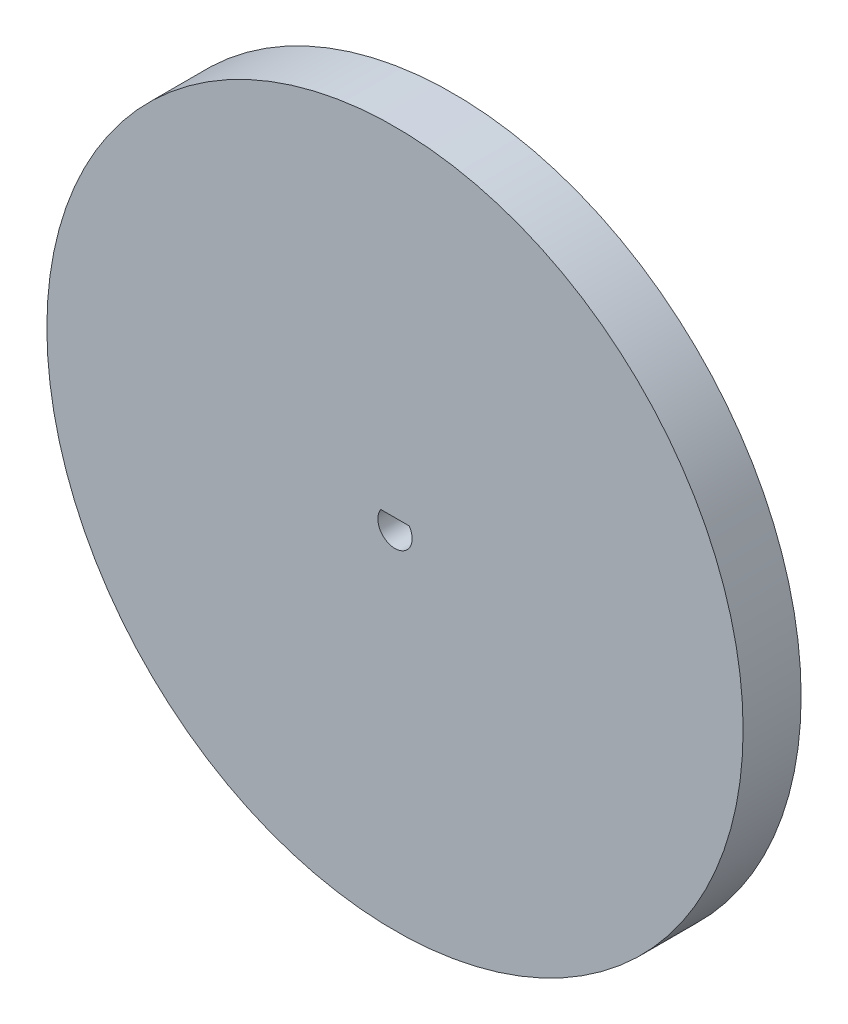
ISO-10303-21;
HEADER;
FILE_DESCRIPTION(('STEP AP214'),'2;1');
FILE_NAME('part.step','',(''),(''),'','','');
FILE_SCHEMA(('AUTOMOTIVE_DESIGN { 1 0 10303 214 1 1 1 1 }'));
ENDSEC;
DATA;
#1=APPLICATION_CONTEXT('core data for automotive mechanical design processes');
#2=APPLICATION_PROTOCOL_DEFINITION('international standard','automotive_design',2000,#1);
#3=PRODUCT_CONTEXT('',#1,'mechanical');
#4=PRODUCT('Part','Part','',(#3));
#5=PRODUCT_RELATED_PRODUCT_CATEGORY('part','',(#4));
#6=PRODUCT_DEFINITION_FORMATION('','',#4);
#7=PRODUCT_DEFINITION_CONTEXT('part definition',#1,'design');
#8=PRODUCT_DEFINITION('design','',#6,#7);
#9=PRODUCT_DEFINITION_SHAPE('','',#8);
#10=(LENGTH_UNIT() NAMED_UNIT(*) SI_UNIT(.MILLI.,.METRE.));
#11=(NAMED_UNIT(*) PLANE_ANGLE_UNIT() SI_UNIT($,.RADIAN.));
#12=(NAMED_UNIT(*) SI_UNIT($,.STERADIAN.) SOLID_ANGLE_UNIT());
#13=UNCERTAINTY_MEASURE_WITH_UNIT(LENGTH_MEASURE(1.E-05),#10,'distance_accuracy_value','');
#14=(GEOMETRIC_REPRESENTATION_CONTEXT(3) GLOBAL_UNCERTAINTY_ASSIGNED_CONTEXT((#13)) GLOBAL_UNIT_ASSIGNED_CONTEXT((#10,
#11,#12)) REPRESENTATION_CONTEXT('',''));
#15=CARTESIAN_POINT('',(0.,0.,0.));
#16=DIRECTION('',(0.,0.,1.));
#17=DIRECTION('',(1.,0.,0.));
#18=AXIS2_PLACEMENT_3D('',#15,#16,#17);
#19=CARTESIAN_POINT('',(0.,0.,6.35));
#20=DIRECTION('',(0.,0.,-1.));
#21=DIRECTION('',(-1.,0.,0.));
#22=AXIS2_PLACEMENT_3D('',#19,#20,#21);
#23=CYLINDRICAL_SURFACE('',#22,76.2);
#24=CARTESIAN_POINT('',(0.,0.,6.35));
#25=DIRECTION('',(0.,0.,1.));
#26=DIRECTION('',(1.,0.,0.));
#27=AXIS2_PLACEMENT_3D('',#24,#25,#26);
#28=CIRCLE('',#27,76.2);
#29=CARTESIAN_POINT('',(76.2,0.,6.35));
#30=VERTEX_POINT('',#29);
#31=EDGE_CURVE('E11',#30,#30,#28,.T.);
#32=ORIENTED_EDGE('',*,*,#31,.F.);
#33=EDGE_LOOP('',(#32));
#34=FACE_BOUND('',#33,.T.);
#35=CARTESIAN_POINT('',(0.,0.,-6.35));
#36=DIRECTION('',(0.,0.,1.));
#37=DIRECTION('',(1.,0.,0.));
#38=AXIS2_PLACEMENT_3D('',#35,#36,#37);
#39=CIRCLE('',#38,76.2);
#40=CARTESIAN_POINT('',(76.2,0.,-6.35));
#41=VERTEX_POINT('',#40);
#42=EDGE_CURVE('E38',#41,#41,#39,.T.);
#43=ORIENTED_EDGE('',*,*,#42,.T.);
#44=EDGE_LOOP('',(#43));
#45=FACE_BOUND('',#44,.T.);
#46=ADVANCED_FACE('F35',(#34,#45),#23,.T.);
#47=CARTESIAN_POINT('',(0.,0.,6.35));
#48=DIRECTION('',(0.,0.,1.));
#49=DIRECTION('',(1.,0.,0.));
#50=AXIS2_PLACEMENT_3D('',#47,#48,#49);
#51=PLANE('',#50);
#52=CARTESIAN_POINT('',(0.,0.,6.35));
#53=DIRECTION('',(0.,0.,1.));
#54=DIRECTION('',(1.,0.,0.));
#55=AXIS2_PLACEMENT_3D('',#52,#53,#54);
#56=CIRCLE('',#55,3.75);
#57=CARTESIAN_POINT('',(-3.1068472765812,2.1,6.35));
#58=VERTEX_POINT('',#57);
#59=CARTESIAN_POINT('',(3.1068472765812,2.1,6.35));
#60=VERTEX_POINT('',#59);
#61=EDGE_CURVE('E49',#58,#60,#56,.T.);
#62=ORIENTED_EDGE('',*,*,#61,.F.);
#63=DIRECTION('',(-1.,0.,0.));
#64=VECTOR('',#63,1.);
#65=CARTESIAN_POINT('',(-3.1068472765812,2.1,6.35));
#66=LINE('',#65,#64);
#67=EDGE_CURVE('E68',#60,#58,#66,.T.);
#68=ORIENTED_EDGE('',*,*,#67,.F.);
#69=EDGE_LOOP('',(#62,#68));
#70=FACE_BOUND('',#69,.T.);
#71=ORIENTED_EDGE('',*,*,#31,.T.);
#72=EDGE_LOOP('',(#71));
#73=FACE_BOUND('',#72,.T.);
#74=ADVANCED_FACE('F72',(#70,#73),#51,.T.);
#75=CARTESIAN_POINT('',(0.,0.,-6.35));
#76=DIRECTION('',(0.,0.,1.));
#77=DIRECTION('',(1.,0.,0.));
#78=AXIS2_PLACEMENT_3D('',#75,#76,#77);
#79=PLANE('',#78);
#80=DIRECTION('',(-1.,0.,0.));
#81=VECTOR('',#80,1.);
#82=CARTESIAN_POINT('',(-3.1068472765812,2.1,-6.35));
#83=LINE('',#82,#81);
#84=CARTESIAN_POINT('',(3.1068472765812,2.1,-6.35));
#85=VERTEX_POINT('',#84);
#86=CARTESIAN_POINT('',(-3.1068472765812,2.1,-6.35));
#87=VERTEX_POINT('',#86);
#88=EDGE_CURVE('E76',#85,#87,#83,.T.);
#89=ORIENTED_EDGE('',*,*,#88,.T.);
#90=CARTESIAN_POINT('',(0.,0.,-6.35));
#91=DIRECTION('',(0.,0.,1.));
#92=DIRECTION('',(1.,0.,0.));
#93=AXIS2_PLACEMENT_3D('',#90,#91,#92);
#94=CIRCLE('',#93,3.75);
#95=EDGE_CURVE('E54',#87,#85,#94,.T.);
#96=ORIENTED_EDGE('',*,*,#95,.T.);
#97=EDGE_LOOP('',(#89,#96));
#98=FACE_BOUND('',#97,.T.);
#99=ORIENTED_EDGE('',*,*,#42,.F.);
#100=EDGE_LOOP('',(#99));
#101=FACE_BOUND('',#100,.T.);
#102=ADVANCED_FACE('F80',(#98,#101),#79,.F.);
#103=CARTESIAN_POINT('',(0.,0.,-6.35));
#104=DIRECTION('',(0.,0.,1.));
#105=DIRECTION('',(1.,0.,0.));
#106=AXIS2_PLACEMENT_3D('',#103,#104,#105);
#107=CYLINDRICAL_SURFACE('',#106,3.75);
#108=ORIENTED_EDGE('',*,*,#61,.T.);
#109=DIRECTION('',(0.,0.,1.));
#110=VECTOR('',#109,1.);
#111=CARTESIAN_POINT('',(3.1068472765812,2.1,-6.35));
#112=LINE('',#111,#110);
#113=EDGE_CURVE('E65',#85,#60,#112,.T.);
#114=ORIENTED_EDGE('',*,*,#113,.F.);
#115=ORIENTED_EDGE('',*,*,#95,.F.);
#116=DIRECTION('',(0.,0.,1.));
#117=VECTOR('',#116,1.);
#118=CARTESIAN_POINT('',(-3.1068472765812,2.1,-6.35));
#119=LINE('',#118,#117);
#120=EDGE_CURVE('E59',#87,#58,#119,.T.);
#121=ORIENTED_EDGE('',*,*,#120,.T.);
#122=EDGE_LOOP('',(#108,#114,#115,#121));
#123=FACE_BOUND('',#122,.T.);
#124=ADVANCED_FACE('F61',(#123),#107,.F.);
#125=CARTESIAN_POINT('',(-3.1068472765812,2.1,-6.35));
#126=DIRECTION('',(0.,1.,0.));
#127=DIRECTION('',(0.,0.,1.));
#128=AXIS2_PLACEMENT_3D('',#125,#126,#127);
#129=PLANE('',#128);
#130=ORIENTED_EDGE('',*,*,#67,.T.);
#131=ORIENTED_EDGE('',*,*,#120,.F.);
#132=ORIENTED_EDGE('',*,*,#88,.F.);
#133=ORIENTED_EDGE('',*,*,#113,.T.);
#134=EDGE_LOOP('',(#130,#131,#132,#133));
#135=FACE_BOUND('',#134,.T.);
#136=ADVANCED_FACE('F69',(#135),#129,.F.);
#137=CLOSED_SHELL('',(#46,#74,#102,#124,#136));
#138=MANIFOLD_SOLID_BREP('B2',#137);
#139=ADVANCED_BREP_SHAPE_REPRESENTATION('',(#18,#138),#14);
#140=SHAPE_DEFINITION_REPRESENTATION(#9,#139);
ENDSEC;
END-ISO-10303-21;
